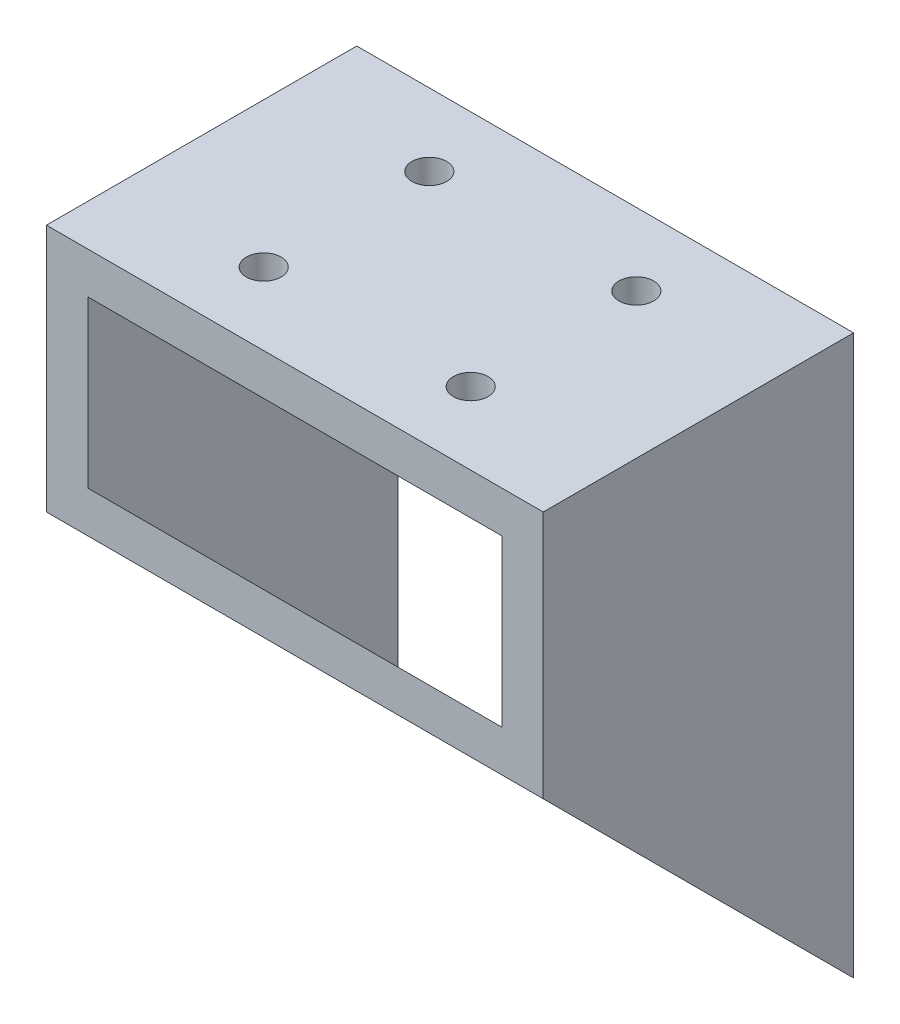
ISO-10303-21;
HEADER;
FILE_DESCRIPTION(('STEP AP214'),'2;1');
FILE_NAME('part.step','',(''),(''),'','','');
FILE_SCHEMA(('AUTOMOTIVE_DESIGN { 1 0 10303 214 1 1 1 1 }'));
ENDSEC;
DATA;
#1=APPLICATION_CONTEXT('core data for automotive mechanical design processes');
#2=APPLICATION_PROTOCOL_DEFINITION('international standard','automotive_design',2000,#1);
#3=PRODUCT_CONTEXT('',#1,'mechanical');
#4=PRODUCT('Part','Part','',(#3));
#5=PRODUCT_RELATED_PRODUCT_CATEGORY('part','',(#4));
#6=PRODUCT_DEFINITION_FORMATION('','',#4);
#7=PRODUCT_DEFINITION_CONTEXT('part definition',#1,'design');
#8=PRODUCT_DEFINITION('design','',#6,#7);
#9=PRODUCT_DEFINITION_SHAPE('','',#8);
#10=(LENGTH_UNIT() NAMED_UNIT(*) SI_UNIT(.MILLI.,.METRE.));
#11=(NAMED_UNIT(*) PLANE_ANGLE_UNIT() SI_UNIT($,.RADIAN.));
#12=(NAMED_UNIT(*) SI_UNIT($,.STERADIAN.) SOLID_ANGLE_UNIT());
#13=UNCERTAINTY_MEASURE_WITH_UNIT(LENGTH_MEASURE(1.E-05),#10,'distance_accuracy_value','');
#14=(GEOMETRIC_REPRESENTATION_CONTEXT(3) GLOBAL_UNCERTAINTY_ASSIGNED_CONTEXT((#13)) GLOBAL_UNIT_ASSIGNED_CONTEXT((#10,
#11,#12)) REPRESENTATION_CONTEXT('',''));
#15=CARTESIAN_POINT('',(0.,0.,0.));
#16=DIRECTION('',(0.,0.,1.));
#17=DIRECTION('',(1.,0.,0.));
#18=AXIS2_PLACEMENT_3D('',#15,#16,#17);
#19=CARTESIAN_POINT('',(5.,0.,0.));
#20=DIRECTION('',(0.,0.707106781186549,-0.707106781186546));
#21=DIRECTION('',(0.,0.707106781186546,0.707106781186549));
#22=AXIS2_PLACEMENT_3D('',#19,#20,#21);
#23=PLANE('',#22);
#24=CARTESIAN_POINT('',(45.,-28.9913780286484,-28.9913780286485));
#25=DIRECTION('',(0.,-0.707106781186549,0.707106781186546));
#26=DIRECTION('',(0.,-0.707106781186546,-0.707106781186549));
#27=AXIS2_PLACEMENT_3D('',#24,#25,#26);
#28=CIRCLE('',#27,2.1);
#29=CARTESIAN_POINT('',(42.9,-28.9913780286484,-28.9913780286485));
#30=VERTEX_POINT('',#29);
#31=CARTESIAN_POINT('',(47.1,-28.9913780286484,-28.9913780286485));
#32=VERTEX_POINT('',#31);
#33=EDGE_CURVE('E177',#30,#32,#28,.T.);
#34=ORIENTED_EDGE('',*,*,#33,.F.);
#35=DIRECTION('',(0.,-0.707106781186546,-0.707106781186549));
#36=VECTOR('',#35,1.);
#37=CARTESIAN_POINT('',(42.9,0.,0.));
#38=LINE('',#37,#36);
#39=CARTESIAN_POINT('',(42.9,-7.778174593052,-7.77817459305206));
#40=VERTEX_POINT('',#39);
#41=EDGE_CURVE('E175',#40,#30,#38,.T.);
#42=ORIENTED_EDGE('',*,*,#41,.F.);
#43=CARTESIAN_POINT('',(45.,-7.77817459305201,-7.77817459305204));
#44=DIRECTION('',(0.,-0.707106781186549,0.707106781186546));
#45=DIRECTION('',(0.,-0.707106781186546,-0.707106781186549));
#46=AXIS2_PLACEMENT_3D('',#43,#44,#45);
#47=CIRCLE('',#46,2.09999999999999);
#48=CARTESIAN_POINT('',(47.1,-7.778174593052,-7.77817459305206));
#49=VERTEX_POINT('',#48);
#50=EDGE_CURVE('E184',#49,#40,#47,.T.);
#51=ORIENTED_EDGE('',*,*,#50,.F.);
#52=DIRECTION('',(0.,-0.707106781186546,-0.707106781186549));
#53=VECTOR('',#52,1.);
#54=CARTESIAN_POINT('',(47.1,0.,0.));
#55=LINE('',#54,#53);
#56=EDGE_CURVE('E181',#49,#32,#55,.T.);
#57=ORIENTED_EDGE('',*,*,#56,.T.);
#58=EDGE_LOOP('',(#34,#42,#51,#57));
#59=FACE_BOUND('',#58,.T.);
#60=DIRECTION('',(0.,-0.707106781186546,-0.707106781186549));
#61=VECTOR('',#60,1.);
#62=CARTESIAN_POINT('',(0.,0.,0.));
#63=LINE('',#62,#61);
#64=CARTESIAN_POINT('',(0.,0.,0.));
#65=VERTEX_POINT('',#64);
#66=CARTESIAN_POINT('',(0.,-37.4766594028869,-37.4766594028871));
#67=VERTEX_POINT('',#66);
#68=EDGE_CURVE('E236',#65,#67,#63,.T.);
#69=ORIENTED_EDGE('',*,*,#68,.T.);
#70=DIRECTION('',(-1.,0.,0.));
#71=VECTOR('',#70,1.);
#72=CARTESIAN_POINT('',(5.,-37.4766594028869,-37.4766594028871));
#73=LINE('',#72,#71);
#74=CARTESIAN_POINT('',(60.,-37.4766594028869,-37.4766594028871));
#75=VERTEX_POINT('',#74);
#76=EDGE_CURVE('E241',#75,#67,#73,.T.);
#77=ORIENTED_EDGE('',*,*,#76,.F.);
#78=DIRECTION('',(0.,-0.707106781186546,-0.707106781186549));
#79=VECTOR('',#78,1.);
#80=CARTESIAN_POINT('',(60.,0.,0.));
#81=LINE('',#80,#79);
#82=CARTESIAN_POINT('',(60.,0.,0.));
#83=VERTEX_POINT('',#82);
#84=EDGE_CURVE('E320',#83,#75,#81,.T.);
#85=ORIENTED_EDGE('',*,*,#84,.F.);
#86=DIRECTION('',(-1.,0.,0.));
#87=VECTOR('',#86,1.);
#88=CARTESIAN_POINT('',(5.,0.,0.));
#89=LINE('',#88,#87);
#90=EDGE_CURVE('E244',#83,#65,#89,.T.);
#91=ORIENTED_EDGE('',*,*,#90,.T.);
#92=EDGE_LOOP('',(#69,#77,#85,#91));
#93=FACE_BOUND('',#92,.T.);
#94=CARTESIAN_POINT('',(15.,-28.9913780286484,-28.9913780286485));
#95=DIRECTION('',(0.,-0.707106781186549,0.707106781186546));
#96=DIRECTION('',(0.,-0.707106781186546,-0.707106781186549));
#97=AXIS2_PLACEMENT_3D('',#94,#95,#96);
#98=CIRCLE('',#97,2.1);
#99=CARTESIAN_POINT('',(17.1,-28.9913780286484,-28.9913780286485));
#100=VERTEX_POINT('',#99);
#101=CARTESIAN_POINT('',(12.9,-28.9913780286484,-28.9913780286485));
#102=VERTEX_POINT('',#101);
#103=EDGE_CURVE('E190',#100,#102,#98,.F.);
#104=ORIENTED_EDGE('',*,*,#103,.T.);
#105=DIRECTION('',(0.,-0.707106781186546,-0.707106781186549));
#106=VECTOR('',#105,1.);
#107=CARTESIAN_POINT('',(12.9,0.,0.));
#108=LINE('',#107,#106);
#109=CARTESIAN_POINT('',(12.9,-7.778174593052,-7.77817459305206));
#110=VERTEX_POINT('',#109);
#111=EDGE_CURVE('E205',#110,#102,#108,.T.);
#112=ORIENTED_EDGE('',*,*,#111,.F.);
#113=CARTESIAN_POINT('',(15.,-7.77817459305201,-7.77817459305205));
#114=DIRECTION('',(0.,-0.707106781186549,0.707106781186546));
#115=DIRECTION('',(0.,-0.707106781186546,-0.707106781186549));
#116=AXIS2_PLACEMENT_3D('',#113,#114,#115);
#117=CIRCLE('',#116,2.09999999999999);
#118=CARTESIAN_POINT('',(17.1,-7.778174593052,-7.77817459305205));
#119=VERTEX_POINT('',#118);
#120=EDGE_CURVE('E202',#110,#119,#117,.F.);
#121=ORIENTED_EDGE('',*,*,#120,.T.);
#122=DIRECTION('',(0.,-0.707106781186546,-0.707106781186549));
#123=VECTOR('',#122,1.);
#124=CARTESIAN_POINT('',(17.1,0.,0.));
#125=LINE('',#124,#123);
#126=EDGE_CURVE('E199',#119,#100,#125,.T.);
#127=ORIENTED_EDGE('',*,*,#126,.T.);
#128=EDGE_LOOP('',(#104,#112,#121,#127));
#129=FACE_BOUND('',#128,.T.);
#130=ADVANCED_FACE('F34',(#59,#93,#129),#23,.F.);
#131=CARTESIAN_POINT('',(55.,5.,0.));
#132=DIRECTION('',(0.,-0.707106781186549,0.707106781186546));
#133=DIRECTION('',(0.,-0.707106781186546,-0.707106781186549));
#134=AXIS2_PLACEMENT_3D('',#131,#132,#133);
#135=PLANE('',#134);
#136=CARTESIAN_POINT('',(45.,-5.27817459305201,-10.278174593052));
#137=DIRECTION('',(0.,-0.707106781186549,0.707106781186546));
#138=DIRECTION('',(0.,-0.707106781186546,-0.707106781186549));
#139=AXIS2_PLACEMENT_3D('',#136,#137,#138);
#140=CIRCLE('',#139,2.09999999999999);
#141=CARTESIAN_POINT('',(47.1,-5.27817459305201,-10.278174593052));
#142=VERTEX_POINT('',#141);
#143=CARTESIAN_POINT('',(42.9,-5.27817459305201,-10.278174593052));
#144=VERTEX_POINT('',#143);
#145=EDGE_CURVE('E42',#142,#144,#140,.T.);
#146=ORIENTED_EDGE('',*,*,#145,.T.);
#147=DIRECTION('',(0.,-0.707106781186546,-0.707106781186549));
#148=VECTOR('',#147,1.);
#149=CARTESIAN_POINT('',(42.9,5.,0.));
#150=LINE('',#149,#148);
#151=CARTESIAN_POINT('',(42.9,-26.4913780286484,-31.4913780286485));
#152=VERTEX_POINT('',#151);
#153=EDGE_CURVE('E11',#144,#152,#150,.T.);
#154=ORIENTED_EDGE('',*,*,#153,.T.);
#155=CARTESIAN_POINT('',(45.,-26.4913780286484,-31.4913780286485));
#156=DIRECTION('',(0.,-0.707106781186549,0.707106781186546));
#157=DIRECTION('',(0.,-0.707106781186546,-0.707106781186549));
#158=AXIS2_PLACEMENT_3D('',#155,#156,#157);
#159=CIRCLE('',#158,2.1);
#160=CARTESIAN_POINT('',(47.1,-26.4913780286484,-31.4913780286485));
#161=VERTEX_POINT('',#160);
#162=EDGE_CURVE('E260',#152,#161,#159,.T.);
#163=ORIENTED_EDGE('',*,*,#162,.T.);
#164=DIRECTION('',(0.,-0.707106781186546,-0.707106781186549));
#165=VECTOR('',#164,1.);
#166=CARTESIAN_POINT('',(47.1,5.,0.));
#167=LINE('',#166,#165);
#168=EDGE_CURVE('E263',#142,#161,#167,.T.);
#169=ORIENTED_EDGE('',*,*,#168,.F.);
#170=EDGE_LOOP('',(#146,#154,#163,#169));
#171=FACE_BOUND('',#170,.T.);
#172=DIRECTION('',(0.,0.707106781186546,0.707106781186549));
#173=VECTOR('',#172,1.);
#174=CARTESIAN_POINT('',(5.,5.,0.));
#175=LINE('',#174,#173);
#176=CARTESIAN_POINT('',(5.,-32.476659402887,-37.4766594028871));
#177=VERTEX_POINT('',#176);
#178=CARTESIAN_POINT('',(5.,5.,0.));
#179=VERTEX_POINT('',#178);
#180=EDGE_CURVE('E211',#177,#179,#175,.T.);
#181=ORIENTED_EDGE('',*,*,#180,.T.);
#182=DIRECTION('',(-1.,0.,0.));
#183=VECTOR('',#182,1.);
#184=CARTESIAN_POINT('',(55.,5.,0.));
#185=LINE('',#184,#183);
#186=CARTESIAN_POINT('',(55.,5.00000000000001,0.));
#187=VERTEX_POINT('',#186);
#188=EDGE_CURVE('E220',#187,#179,#185,.T.);
#189=ORIENTED_EDGE('',*,*,#188,.F.);
#190=DIRECTION('',(0.,0.707106781186546,0.707106781186549));
#191=VECTOR('',#190,1.);
#192=CARTESIAN_POINT('',(55.,5.,0.));
#193=LINE('',#192,#191);
#194=CARTESIAN_POINT('',(55.,-32.4766594028869,-37.4766594028871));
#195=VERTEX_POINT('',#194);
#196=EDGE_CURVE('E218',#195,#187,#193,.T.);
#197=ORIENTED_EDGE('',*,*,#196,.F.);
#198=DIRECTION('',(-1.,0.,0.));
#199=VECTOR('',#198,1.);
#200=CARTESIAN_POINT('',(55.,-32.4766594028869,-37.4766594028871));
#201=LINE('',#200,#199);
#202=EDGE_CURVE('E165',#195,#177,#201,.T.);
#203=ORIENTED_EDGE('',*,*,#202,.T.);
#204=EDGE_LOOP('',(#181,#189,#197,#203));
#205=FACE_BOUND('',#204,.T.);
#206=CARTESIAN_POINT('',(15.,-26.4913780286484,-31.4913780286485));
#207=DIRECTION('',(0.,-0.707106781186549,0.707106781186546));
#208=DIRECTION('',(0.,-0.707106781186546,-0.707106781186549));
#209=AXIS2_PLACEMENT_3D('',#206,#207,#208);
#210=CIRCLE('',#209,2.1);
#211=CARTESIAN_POINT('',(17.1,-26.4913780286484,-31.4913780286485));
#212=VERTEX_POINT('',#211);
#213=CARTESIAN_POINT('',(12.9,-26.4913780286484,-31.4913780286485));
#214=VERTEX_POINT('',#213);
#215=EDGE_CURVE('E258',#212,#214,#210,.F.);
#216=ORIENTED_EDGE('',*,*,#215,.F.);
#217=DIRECTION('',(0.,-0.707106781186546,-0.707106781186549));
#218=VECTOR('',#217,1.);
#219=CARTESIAN_POINT('',(17.1,4.99999999999999,0.));
#220=LINE('',#219,#218);
#221=CARTESIAN_POINT('',(17.1,-5.278174593052,-10.278174593052));
#222=VERTEX_POINT('',#221);
#223=EDGE_CURVE('E250',#222,#212,#220,.T.);
#224=ORIENTED_EDGE('',*,*,#223,.F.);
#225=CARTESIAN_POINT('',(15.,-5.27817459305201,-10.278174593052));
#226=DIRECTION('',(0.,-0.707106781186549,0.707106781186546));
#227=DIRECTION('',(0.,-0.707106781186546,-0.707106781186549));
#228=AXIS2_PLACEMENT_3D('',#225,#226,#227);
#229=CIRCLE('',#228,2.09999999999999);
#230=CARTESIAN_POINT('',(12.9,-5.27817459305201,-10.278174593052));
#231=VERTEX_POINT('',#230);
#232=EDGE_CURVE('E252',#231,#222,#229,.F.);
#233=ORIENTED_EDGE('',*,*,#232,.F.);
#234=DIRECTION('',(0.,-0.707106781186546,-0.707106781186549));
#235=VECTOR('',#234,1.);
#236=CARTESIAN_POINT('',(12.9,5.,0.));
#237=LINE('',#236,#235);
#238=EDGE_CURVE('E255',#231,#214,#237,.T.);
#239=ORIENTED_EDGE('',*,*,#238,.T.);
#240=EDGE_LOOP('',(#216,#224,#233,#239));
#241=FACE_BOUND('',#240,.T.);
#242=ADVANCED_FACE('F268',(#171,#205,#241),#135,.F.);
#243=CARTESIAN_POINT('',(5.,30.,0.));
#244=DIRECTION('',(0.,-1.,0.));
#245=DIRECTION('',(0.,0.,-1.));
#246=AXIS2_PLACEMENT_3D('',#243,#244,#245);
#247=PLANE('',#246);
#248=CARTESIAN_POINT('',(17.5,30.,-28.7383297014436));
#249=DIRECTION('',(0.,1.,0.));
#250=DIRECTION('',(0.,0.,-1.));
#251=AXIS2_PLACEMENT_3D('',#248,#249,#250);
#252=CIRCLE('',#251,2.1);
#253=CARTESIAN_POINT('',(17.5,30.,-30.8383297014435));
#254=VERTEX_POINT('',#253);
#255=EDGE_CURVE('E349',#254,#254,#252,.T.);
#256=ORIENTED_EDGE('',*,*,#255,.F.);
#257=EDGE_LOOP('',(#256));
#258=FACE_BOUND('',#257,.T.);
#259=CARTESIAN_POINT('',(42.5,30.,-8.73832970144355));
#260=DIRECTION('',(0.,1.,0.));
#261=DIRECTION('',(0.,0.,-1.));
#262=AXIS2_PLACEMENT_3D('',#259,#260,#261);
#263=CIRCLE('',#262,2.1);
#264=CARTESIAN_POINT('',(42.5,30.,-10.8383297014435));
#265=VERTEX_POINT('',#264);
#266=EDGE_CURVE('E343',#265,#265,#263,.T.);
#267=ORIENTED_EDGE('',*,*,#266,.F.);
#268=EDGE_LOOP('',(#267));
#269=FACE_BOUND('',#268,.T.);
#270=CARTESIAN_POINT('',(17.5,30.,-8.73832970144355));
#271=DIRECTION('',(0.,1.,0.));
#272=DIRECTION('',(0.,0.,1.));
#273=AXIS2_PLACEMENT_3D('',#270,#271,#272);
#274=CIRCLE('',#273,2.1);
#275=CARTESIAN_POINT('',(17.5,30.,-6.63832970144355));
#276=VERTEX_POINT('',#275);
#277=EDGE_CURVE('E337',#276,#276,#274,.T.);
#278=ORIENTED_EDGE('',*,*,#277,.F.);
#279=EDGE_LOOP('',(#278));
#280=FACE_BOUND('',#279,.T.);
#281=CARTESIAN_POINT('',(42.5,30.,-28.7383297014435));
#282=DIRECTION('',(0.,1.,0.));
#283=DIRECTION('',(0.,0.,1.));
#284=AXIS2_PLACEMENT_3D('',#281,#282,#283);
#285=CIRCLE('',#284,2.1);
#286=CARTESIAN_POINT('',(42.5,30.,-26.6383297014435));
#287=VERTEX_POINT('',#286);
#288=EDGE_CURVE('E331',#287,#287,#285,.T.);
#289=ORIENTED_EDGE('',*,*,#288,.F.);
#290=EDGE_LOOP('',(#289));
#291=FACE_BOUND('',#290,.T.);
#292=DIRECTION('',(0.,0.,1.));
#293=VECTOR('',#292,1.);
#294=CARTESIAN_POINT('',(0.,30.,0.));
#295=LINE('',#294,#293);
#296=CARTESIAN_POINT('',(0.,30.,-37.4766594028871));
#297=VERTEX_POINT('',#296);
#298=CARTESIAN_POINT('',(0.,30.,0.));
#299=VERTEX_POINT('',#298);
#300=EDGE_CURVE('E226',#297,#299,#295,.T.);
#301=ORIENTED_EDGE('',*,*,#300,.T.);
#302=DIRECTION('',(-1.,0.,0.));
#303=VECTOR('',#302,1.);
#304=CARTESIAN_POINT('',(5.,30.,0.));
#305=LINE('',#304,#303);
#306=CARTESIAN_POINT('',(60.,30.,0.));
#307=VERTEX_POINT('',#306);
#308=EDGE_CURVE('E247',#307,#299,#305,.T.);
#309=ORIENTED_EDGE('',*,*,#308,.F.);
#310=DIRECTION('',(0.,0.,1.));
#311=VECTOR('',#310,1.);
#312=CARTESIAN_POINT('',(60.,30.,-37.4766594028871));
#313=LINE('',#312,#311);
#314=CARTESIAN_POINT('',(60.,30.,-37.4766594028871));
#315=VERTEX_POINT('',#314);
#316=EDGE_CURVE('E167',#315,#307,#313,.T.);
#317=ORIENTED_EDGE('',*,*,#316,.F.);
#318=DIRECTION('',(-1.,0.,0.));
#319=VECTOR('',#318,1.);
#320=CARTESIAN_POINT('',(5.,30.,-37.4766594028871));
#321=LINE('',#320,#319);
#322=EDGE_CURVE('E231',#315,#297,#321,.T.);
#323=ORIENTED_EDGE('',*,*,#322,.T.);
#324=EDGE_LOOP('',(#301,#309,#317,#323));
#325=FACE_BOUND('',#324,.T.);
#326=ADVANCED_FACE('F36',(#258,#269,#280,#291,#325),#247,.F.);
#327=CARTESIAN_POINT('',(5.,30.,0.));
#328=DIRECTION('',(0.,0.,-1.));
#329=DIRECTION('',(0.,1.,0.));
#330=AXIS2_PLACEMENT_3D('',#327,#328,#329);
#331=PLANE('',#330);
#332=DIRECTION('',(1.,0.,0.));
#333=VECTOR('',#332,1.);
#334=CARTESIAN_POINT('',(0.,25.,0.));
#335=LINE('',#334,#333);
#336=CARTESIAN_POINT('',(5.,25.,0.));
#337=VERTEX_POINT('',#336);
#338=CARTESIAN_POINT('',(55.,25.,0.));
#339=VERTEX_POINT('',#338);
#340=EDGE_CURVE('E152',#337,#339,#335,.T.);
#341=ORIENTED_EDGE('',*,*,#340,.T.);
#342=DIRECTION('',(0.,-1.,0.));
#343=VECTOR('',#342,1.);
#344=CARTESIAN_POINT('',(55.,30.,0.));
#345=LINE('',#344,#343);
#346=EDGE_CURVE('E160',#339,#187,#345,.T.);
#347=ORIENTED_EDGE('',*,*,#346,.T.);
#348=ORIENTED_EDGE('',*,*,#188,.T.);
#349=DIRECTION('',(0.,-1.,0.));
#350=VECTOR('',#349,1.);
#351=CARTESIAN_POINT('',(5.,30.,0.));
#352=LINE('',#351,#350);
#353=EDGE_CURVE('E227',#337,#179,#352,.T.);
#354=ORIENTED_EDGE('',*,*,#353,.F.);
#355=EDGE_LOOP('',(#341,#347,#348,#354));
#356=FACE_BOUND('',#355,.T.);
#357=ORIENTED_EDGE('',*,*,#90,.F.);
#358=DIRECTION('',(0.,-1.,0.));
#359=VECTOR('',#358,1.);
#360=CARTESIAN_POINT('',(60.,30.,0.));
#361=LINE('',#360,#359);
#362=EDGE_CURVE('E170',#307,#83,#361,.T.);
#363=ORIENTED_EDGE('',*,*,#362,.F.);
#364=ORIENTED_EDGE('',*,*,#308,.T.);
#365=DIRECTION('',(0.,-1.,0.));
#366=VECTOR('',#365,1.);
#367=CARTESIAN_POINT('',(0.,30.,0.));
#368=LINE('',#367,#366);
#369=EDGE_CURVE('E234',#299,#65,#368,.T.);
#370=ORIENTED_EDGE('',*,*,#369,.T.);
#371=EDGE_LOOP('',(#357,#363,#364,#370));
#372=FACE_BOUND('',#371,.T.);
#373=ADVANCED_FACE('F305',(#356,#372),#331,.F.);
#374=CARTESIAN_POINT('',(5.,-37.4766594028869,-37.4766594028871));
#375=DIRECTION('',(0.,0.,1.));
#376=DIRECTION('',(1.,0.,0.));
#377=AXIS2_PLACEMENT_3D('',#374,#375,#376);
#378=PLANE('',#377);
#379=DIRECTION('',(-1.,0.,0.));
#380=VECTOR('',#379,1.);
#381=CARTESIAN_POINT('',(0.,25.,-37.4766594028871));
#382=LINE('',#381,#380);
#383=CARTESIAN_POINT('',(55.,25.,-37.4766594028871));
#384=VERTEX_POINT('',#383);
#385=CARTESIAN_POINT('',(5.,25.,-37.4766594028871));
#386=VERTEX_POINT('',#385);
#387=EDGE_CURVE('E144',#384,#386,#382,.T.);
#388=ORIENTED_EDGE('',*,*,#387,.T.);
#389=DIRECTION('',(0.,1.,0.));
#390=VECTOR('',#389,1.);
#391=CARTESIAN_POINT('',(5.,-37.4766594028869,-37.4766594028871));
#392=LINE('',#391,#390);
#393=EDGE_CURVE('E54',#177,#386,#392,.T.);
#394=ORIENTED_EDGE('',*,*,#393,.F.);
#395=ORIENTED_EDGE('',*,*,#202,.F.);
#396=DIRECTION('',(0.,1.,0.));
#397=VECTOR('',#396,1.);
#398=CARTESIAN_POINT('',(55.,-37.4766594028869,-37.4766594028871));
#399=LINE('',#398,#397);
#400=EDGE_CURVE('E159',#195,#384,#399,.T.);
#401=ORIENTED_EDGE('',*,*,#400,.T.);
#402=EDGE_LOOP('',(#388,#394,#395,#401));
#403=FACE_BOUND('',#402,.T.);
#404=DIRECTION('',(0.,1.,0.));
#405=VECTOR('',#404,1.);
#406=CARTESIAN_POINT('',(0.,-37.4766594028869,-37.4766594028871));
#407=LINE('',#406,#405);
#408=EDGE_CURVE('E229',#67,#297,#407,.T.);
#409=ORIENTED_EDGE('',*,*,#408,.T.);
#410=ORIENTED_EDGE('',*,*,#322,.F.);
#411=DIRECTION('',(0.,1.,0.));
#412=VECTOR('',#411,1.);
#413=CARTESIAN_POINT('',(60.,-37.4766594028869,-37.4766594028871));
#414=LINE('',#413,#412);
#415=EDGE_CURVE('E178',#75,#315,#414,.T.);
#416=ORIENTED_EDGE('',*,*,#415,.F.);
#417=ORIENTED_EDGE('',*,*,#76,.T.);
#418=EDGE_LOOP('',(#409,#410,#416,#417));
#419=FACE_BOUND('',#418,.T.);
#420=ADVANCED_FACE('F162',(#403,#419),#378,.F.);
#421=CARTESIAN_POINT('',(5.,0.,0.));
#422=DIRECTION('',(1.,0.,0.));
#423=DIRECTION('',(0.,0.,-1.));
#424=AXIS2_PLACEMENT_3D('',#421,#422,#423);
#425=PLANE('',#424);
#426=DIRECTION('',(0.,0.,-1.));
#427=VECTOR('',#426,1.);
#428=CARTESIAN_POINT('',(5.,25.,0.));
#429=LINE('',#428,#427);
#430=EDGE_CURVE('E49',#337,#386,#429,.T.);
#431=ORIENTED_EDGE('',*,*,#430,.F.);
#432=ORIENTED_EDGE('',*,*,#353,.T.);
#433=ORIENTED_EDGE('',*,*,#180,.F.);
#434=ORIENTED_EDGE('',*,*,#393,.T.);
#435=EDGE_LOOP('',(#431,#432,#433,#434));
#436=FACE_BOUND('',#435,.T.);
#437=ADVANCED_FACE('F312',(#436),#425,.T.);
#438=CARTESIAN_POINT('',(0.,0.,0.));
#439=DIRECTION('',(1.,0.,0.));
#440=DIRECTION('',(0.,0.,-1.));
#441=AXIS2_PLACEMENT_3D('',#438,#439,#440);
#442=PLANE('',#441);
#443=ORIENTED_EDGE('',*,*,#68,.F.);
#444=ORIENTED_EDGE('',*,*,#369,.F.);
#445=ORIENTED_EDGE('',*,*,#300,.F.);
#446=ORIENTED_EDGE('',*,*,#408,.F.);
#447=EDGE_LOOP('',(#443,#444,#445,#446));
#448=FACE_BOUND('',#447,.T.);
#449=ADVANCED_FACE('F374',(#448),#442,.F.);
#450=CARTESIAN_POINT('',(15.,6.36396103067905,-64.3467170879758));
#451=DIRECTION('',(0.,-0.707106781186549,0.707106781186546));
#452=DIRECTION('',(0.,-0.707106781186546,-0.707106781186549));
#453=AXIS2_PLACEMENT_3D('',#450,#451,#452);
#454=CYLINDRICAL_SURFACE('',#453,2.1);
#455=ORIENTED_EDGE('',*,*,#215,.T.);
#456=DIRECTION('',(0.,-0.707106781186549,0.707106781186546));
#457=VECTOR('',#456,1.);
#458=CARTESIAN_POINT('',(12.9,6.36396103067905,-64.3467170879758));
#459=LINE('',#458,#457);
#460=EDGE_CURVE('E209',#214,#102,#459,.T.);
#461=ORIENTED_EDGE('',*,*,#460,.T.);
#462=ORIENTED_EDGE('',*,*,#103,.F.);
#463=DIRECTION('',(0.,-0.707106781186549,0.707106781186546));
#464=VECTOR('',#463,1.);
#465=CARTESIAN_POINT('',(17.1,6.36396103067906,-64.3467170879758));
#466=LINE('',#465,#464);
#467=EDGE_CURVE('E208',#212,#100,#466,.T.);
#468=ORIENTED_EDGE('',*,*,#467,.F.);
#469=EDGE_LOOP('',(#455,#461,#462,#468));
#470=FACE_BOUND('',#469,.T.);
#471=ADVANCED_FACE('F399',(#470),#454,.F.);
#472=CARTESIAN_POINT('',(12.9,35.3553390593275,-35.3553390593273));
#473=DIRECTION('',(-1.,0.,0.));
#474=DIRECTION('',(0.,0.,1.));
#475=AXIS2_PLACEMENT_3D('',#472,#473,#474);
#476=PLANE('',#475);
#477=DIRECTION('',(0.,-0.707106781186549,0.707106781186546));
#478=VECTOR('',#477,1.);
#479=CARTESIAN_POINT('',(12.9,27.5771644662754,-43.1335136523794));
#480=LINE('',#479,#478);
#481=EDGE_CURVE('E212',#231,#110,#480,.T.);
#482=ORIENTED_EDGE('',*,*,#481,.T.);
#483=ORIENTED_EDGE('',*,*,#111,.T.);
#484=ORIENTED_EDGE('',*,*,#460,.F.);
#485=ORIENTED_EDGE('',*,*,#238,.F.);
#486=EDGE_LOOP('',(#482,#483,#484,#485));
#487=FACE_BOUND('',#486,.T.);
#488=ADVANCED_FACE('F396',(#487),#476,.F.);
#489=CARTESIAN_POINT('',(15.,27.5771644662754,-43.1335136523794));
#490=DIRECTION('',(0.,-0.707106781186549,0.707106781186546));
#491=DIRECTION('',(0.,-0.707106781186546,-0.707106781186549));
#492=AXIS2_PLACEMENT_3D('',#489,#490,#491);
#493=CYLINDRICAL_SURFACE('',#492,2.09999999999999);
#494=ORIENTED_EDGE('',*,*,#232,.T.);
#495=DIRECTION('',(0.,-0.707106781186549,0.707106781186546));
#496=VECTOR('',#495,1.);
#497=CARTESIAN_POINT('',(17.1,27.5771644662754,-43.1335136523794));
#498=LINE('',#497,#496);
#499=EDGE_CURVE('E214',#222,#119,#498,.T.);
#500=ORIENTED_EDGE('',*,*,#499,.T.);
#501=ORIENTED_EDGE('',*,*,#120,.F.);
#502=ORIENTED_EDGE('',*,*,#481,.F.);
#503=EDGE_LOOP('',(#494,#500,#501,#502));
#504=FACE_BOUND('',#503,.T.);
#505=ADVANCED_FACE('F392',(#504),#493,.F.);
#506=CARTESIAN_POINT('',(17.1,35.3553390593275,-35.3553390593273));
#507=DIRECTION('',(-1.,0.,0.));
#508=DIRECTION('',(0.,0.,1.));
#509=AXIS2_PLACEMENT_3D('',#506,#507,#508);
#510=PLANE('',#509);
#511=ORIENTED_EDGE('',*,*,#223,.T.);
#512=ORIENTED_EDGE('',*,*,#467,.T.);
#513=ORIENTED_EDGE('',*,*,#126,.F.);
#514=ORIENTED_EDGE('',*,*,#499,.F.);
#515=EDGE_LOOP('',(#511,#512,#513,#514));
#516=FACE_BOUND('',#515,.T.);
#517=ADVANCED_FACE('F388',(#516),#510,.T.);
#518=CARTESIAN_POINT('',(42.9,35.3553390593275,-35.3553390593273));
#519=DIRECTION('',(-1.,0.,0.));
#520=DIRECTION('',(0.,0.,1.));
#521=AXIS2_PLACEMENT_3D('',#518,#519,#520);
#522=PLANE('',#521);
#523=DIRECTION('',(0.,-0.707106781186549,0.707106781186546));
#524=VECTOR('',#523,1.);
#525=CARTESIAN_POINT('',(42.9,27.5771644662754,-43.1335136523794));
#526=LINE('',#525,#524);
#527=EDGE_CURVE('E188',#144,#40,#526,.T.);
#528=ORIENTED_EDGE('',*,*,#527,.T.);
#529=ORIENTED_EDGE('',*,*,#41,.T.);
#530=DIRECTION('',(0.,-0.707106781186549,0.707106781186546));
#531=VECTOR('',#530,1.);
#532=CARTESIAN_POINT('',(42.9,6.36396103067905,-64.3467170879758));
#533=LINE('',#532,#531);
#534=EDGE_CURVE('E187',#152,#30,#533,.T.);
#535=ORIENTED_EDGE('',*,*,#534,.F.);
#536=ORIENTED_EDGE('',*,*,#153,.F.);
#537=EDGE_LOOP('',(#528,#529,#535,#536));
#538=FACE_BOUND('',#537,.T.);
#539=ADVANCED_FACE('F284',(#538),#522,.F.);
#540=CARTESIAN_POINT('',(45.,27.5771644662754,-43.1335136523794));
#541=DIRECTION('',(0.,-0.707106781186549,0.707106781186546));
#542=DIRECTION('',(0.,-0.707106781186546,-0.707106781186549));
#543=AXIS2_PLACEMENT_3D('',#540,#541,#542);
#544=CYLINDRICAL_SURFACE('',#543,2.09999999999999);
#545=DIRECTION('',(0.,-0.707106781186549,0.707106781186546));
#546=VECTOR('',#545,1.);
#547=CARTESIAN_POINT('',(47.1,27.5771644662754,-43.1335136523794));
#548=LINE('',#547,#546);
#549=EDGE_CURVE('E191',#142,#49,#548,.T.);
#550=ORIENTED_EDGE('',*,*,#549,.T.);
#551=ORIENTED_EDGE('',*,*,#50,.T.);
#552=ORIENTED_EDGE('',*,*,#527,.F.);
#553=ORIENTED_EDGE('',*,*,#145,.F.);
#554=EDGE_LOOP('',(#550,#551,#552,#553));
#555=FACE_BOUND('',#554,.T.);
#556=ADVANCED_FACE('F273',(#555),#544,.F.);
#557=CARTESIAN_POINT('',(47.1,35.3553390593275,-35.3553390593273));
#558=DIRECTION('',(-1.,0.,0.));
#559=DIRECTION('',(0.,0.,1.));
#560=AXIS2_PLACEMENT_3D('',#557,#558,#559);
#561=PLANE('',#560);
#562=ORIENTED_EDGE('',*,*,#168,.T.);
#563=DIRECTION('',(0.,-0.707106781186549,0.707106781186546));
#564=VECTOR('',#563,1.);
#565=CARTESIAN_POINT('',(47.1,6.36396103067906,-64.3467170879758));
#566=LINE('',#565,#564);
#567=EDGE_CURVE('E193',#161,#32,#566,.T.);
#568=ORIENTED_EDGE('',*,*,#567,.T.);
#569=ORIENTED_EDGE('',*,*,#56,.F.);
#570=ORIENTED_EDGE('',*,*,#549,.F.);
#571=EDGE_LOOP('',(#562,#568,#569,#570));
#572=FACE_BOUND('',#571,.T.);
#573=ADVANCED_FACE('F276',(#572),#561,.T.);
#574=CARTESIAN_POINT('',(45.,6.36396103067905,-64.3467170879758));
#575=DIRECTION('',(0.,-0.707106781186549,0.707106781186546));
#576=DIRECTION('',(0.,-0.707106781186546,-0.707106781186549));
#577=AXIS2_PLACEMENT_3D('',#574,#575,#576);
#578=CYLINDRICAL_SURFACE('',#577,2.1);
#579=ORIENTED_EDGE('',*,*,#534,.T.);
#580=ORIENTED_EDGE('',*,*,#33,.T.);
#581=ORIENTED_EDGE('',*,*,#567,.F.);
#582=ORIENTED_EDGE('',*,*,#162,.F.);
#583=EDGE_LOOP('',(#579,#580,#581,#582));
#584=FACE_BOUND('',#583,.T.);
#585=ADVANCED_FACE('F286',(#584),#578,.F.);
#586=CARTESIAN_POINT('',(55.,0.,0.));
#587=DIRECTION('',(1.,0.,0.));
#588=DIRECTION('',(0.,0.,-1.));
#589=AXIS2_PLACEMENT_3D('',#586,#587,#588);
#590=PLANE('',#589);
#591=ORIENTED_EDGE('',*,*,#346,.F.);
#592=DIRECTION('',(0.,0.,-1.));
#593=VECTOR('',#592,1.);
#594=CARTESIAN_POINT('',(55.,25.,0.));
#595=LINE('',#594,#593);
#596=EDGE_CURVE('E148',#339,#384,#595,.T.);
#597=ORIENTED_EDGE('',*,*,#596,.T.);
#598=ORIENTED_EDGE('',*,*,#400,.F.);
#599=ORIENTED_EDGE('',*,*,#196,.T.);
#600=EDGE_LOOP('',(#591,#597,#598,#599));
#601=FACE_BOUND('',#600,.T.);
#602=ADVANCED_FACE('F157',(#601),#590,.F.);
#603=CARTESIAN_POINT('',(60.,0.,0.));
#604=DIRECTION('',(1.,0.,0.));
#605=DIRECTION('',(0.,0.,-1.));
#606=AXIS2_PLACEMENT_3D('',#603,#604,#605);
#607=PLANE('',#606);
#608=ORIENTED_EDGE('',*,*,#415,.T.);
#609=ORIENTED_EDGE('',*,*,#316,.T.);
#610=ORIENTED_EDGE('',*,*,#362,.T.);
#611=ORIENTED_EDGE('',*,*,#84,.T.);
#612=EDGE_LOOP('',(#608,#609,#610,#611));
#613=FACE_BOUND('',#612,.T.);
#614=ADVANCED_FACE('F293',(#613),#607,.T.);
#615=CARTESIAN_POINT('',(0.,25.,0.));
#616=DIRECTION('',(0.,-1.,0.));
#617=DIRECTION('',(0.,0.,-1.));
#618=AXIS2_PLACEMENT_3D('',#615,#616,#617);
#619=PLANE('',#618);
#620=CARTESIAN_POINT('',(17.5,25.,-28.7383297014436));
#621=DIRECTION('',(0.,1.,0.));
#622=DIRECTION('',(0.,0.,-1.));
#623=AXIS2_PLACEMENT_3D('',#620,#621,#622);
#624=CIRCLE('',#623,2.1);
#625=CARTESIAN_POINT('',(17.5,25.,-30.8383297014435));
#626=VERTEX_POINT('',#625);
#627=EDGE_CURVE('E334',#626,#626,#624,.T.);
#628=ORIENTED_EDGE('',*,*,#627,.T.);
#629=EDGE_LOOP('',(#628));
#630=FACE_BOUND('',#629,.T.);
#631=CARTESIAN_POINT('',(42.5,25.,-8.73832970144355));
#632=DIRECTION('',(0.,1.,0.));
#633=DIRECTION('',(0.,0.,-1.));
#634=AXIS2_PLACEMENT_3D('',#631,#632,#633);
#635=CIRCLE('',#634,2.1);
#636=CARTESIAN_POINT('',(42.5,25.,-10.8383297014435));
#637=VERTEX_POINT('',#636);
#638=EDGE_CURVE('E346',#637,#637,#635,.T.);
#639=ORIENTED_EDGE('',*,*,#638,.T.);
#640=EDGE_LOOP('',(#639));
#641=FACE_BOUND('',#640,.T.);
#642=CARTESIAN_POINT('',(17.5,25.,-8.73832970144355));
#643=DIRECTION('',(0.,1.,0.));
#644=DIRECTION('',(0.,0.,1.));
#645=AXIS2_PLACEMENT_3D('',#642,#643,#644);
#646=CIRCLE('',#645,2.1);
#647=CARTESIAN_POINT('',(17.5,25.,-6.63832970144355));
#648=VERTEX_POINT('',#647);
#649=EDGE_CURVE('E340',#648,#648,#646,.T.);
#650=ORIENTED_EDGE('',*,*,#649,.T.);
#651=EDGE_LOOP('',(#650));
#652=FACE_BOUND('',#651,.T.);
#653=CARTESIAN_POINT('',(42.5,25.,-28.7383297014435));
#654=DIRECTION('',(0.,1.,0.));
#655=DIRECTION('',(0.,0.,1.));
#656=AXIS2_PLACEMENT_3D('',#653,#654,#655);
#657=CIRCLE('',#656,2.1);
#658=CARTESIAN_POINT('',(42.5,25.,-26.6383297014435));
#659=VERTEX_POINT('',#658);
#660=EDGE_CURVE('E330',#659,#659,#657,.T.);
#661=ORIENTED_EDGE('',*,*,#660,.T.);
#662=EDGE_LOOP('',(#661));
#663=FACE_BOUND('',#662,.T.);
#664=ORIENTED_EDGE('',*,*,#340,.F.);
#665=ORIENTED_EDGE('',*,*,#430,.T.);
#666=ORIENTED_EDGE('',*,*,#387,.F.);
#667=ORIENTED_EDGE('',*,*,#596,.F.);
#668=EDGE_LOOP('',(#664,#665,#666,#667));
#669=FACE_BOUND('',#668,.T.);
#670=ADVANCED_FACE('F147',(#630,#641,#652,#663,#669),#619,.T.);
#671=CARTESIAN_POINT('',(42.5,25.,-28.7383297014435));
#672=DIRECTION('',(0.,1.,0.));
#673=DIRECTION('',(0.,0.,1.));
#674=AXIS2_PLACEMENT_3D('',#671,#672,#673);
#675=CYLINDRICAL_SURFACE('',#674,2.1);
#676=ORIENTED_EDGE('',*,*,#660,.F.);
#677=EDGE_LOOP('',(#676));
#678=FACE_BOUND('',#677,.T.);
#679=ORIENTED_EDGE('',*,*,#288,.T.);
#680=EDGE_LOOP('',(#679));
#681=FACE_BOUND('',#680,.T.);
#682=ADVANCED_FACE('F380',(#678,#681),#675,.F.);
#683=CARTESIAN_POINT('',(17.5,25.,-8.73832970144355));
#684=DIRECTION('',(0.,1.,0.));
#685=DIRECTION('',(0.,0.,1.));
#686=AXIS2_PLACEMENT_3D('',#683,#684,#685);
#687=CYLINDRICAL_SURFACE('',#686,2.1);
#688=ORIENTED_EDGE('',*,*,#649,.F.);
#689=EDGE_LOOP('',(#688));
#690=FACE_BOUND('',#689,.T.);
#691=ORIENTED_EDGE('',*,*,#277,.T.);
#692=EDGE_LOOP('',(#691));
#693=FACE_BOUND('',#692,.T.);
#694=ADVANCED_FACE('F529',(#690,#693),#687,.F.);
#695=CARTESIAN_POINT('',(42.5,25.,-8.73832970144355));
#696=DIRECTION('',(0.,1.,0.));
#697=DIRECTION('',(0.,0.,1.));
#698=AXIS2_PLACEMENT_3D('',#695,#696,#697);
#699=CYLINDRICAL_SURFACE('',#698,2.1);
#700=ORIENTED_EDGE('',*,*,#638,.F.);
#701=EDGE_LOOP('',(#700));
#702=FACE_BOUND('',#701,.T.);
#703=ORIENTED_EDGE('',*,*,#266,.T.);
#704=EDGE_LOOP('',(#703));
#705=FACE_BOUND('',#704,.T.);
#706=ADVANCED_FACE('F360',(#702,#705),#699,.F.);
#707=CARTESIAN_POINT('',(17.5,25.,-28.7383297014436));
#708=DIRECTION('',(0.,1.,0.));
#709=DIRECTION('',(0.,0.,1.));
#710=AXIS2_PLACEMENT_3D('',#707,#708,#709);
#711=CYLINDRICAL_SURFACE('',#710,2.1);
#712=ORIENTED_EDGE('',*,*,#627,.F.);
#713=EDGE_LOOP('',(#712));
#714=FACE_BOUND('',#713,.T.);
#715=ORIENTED_EDGE('',*,*,#255,.T.);
#716=EDGE_LOOP('',(#715));
#717=FACE_BOUND('',#716,.T.);
#718=ADVANCED_FACE('F357',(#714,#717),#711,.F.);
#719=CLOSED_SHELL('',(#130,#242,#326,#373,#420,#437,#449,#471,#488,#505,#517,#539,#556,#573,
#585,#602,#614,#670,#682,#694,#706,#718));
#720=MANIFOLD_SOLID_BREP('B2',#719);
#721=ADVANCED_BREP_SHAPE_REPRESENTATION('',(#18,#720),#14);
#722=SHAPE_DEFINITION_REPRESENTATION(#9,#721);
ENDSEC;
END-ISO-10303-21;
